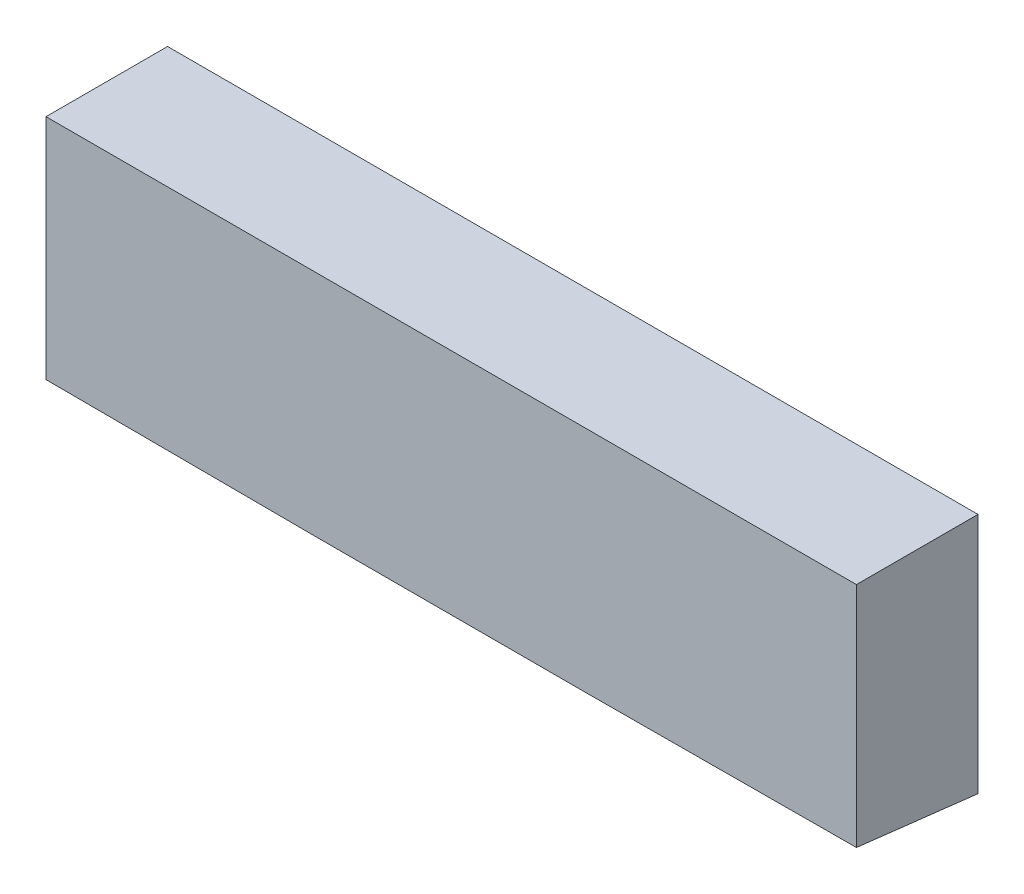
ISO-10303-21;
HEADER;
FILE_DESCRIPTION(('STEP AP214'),'2;1');
FILE_NAME('part.step','',(''),(''),'','','');
FILE_SCHEMA(('AUTOMOTIVE_DESIGN { 1 0 10303 214 1 1 1 1 }'));
ENDSEC;
DATA;
#1=APPLICATION_CONTEXT('core data for automotive mechanical design processes');
#2=APPLICATION_PROTOCOL_DEFINITION('international standard','automotive_design',2000,#1);
#3=PRODUCT_CONTEXT('',#1,'mechanical');
#4=PRODUCT('Part','Part','',(#3));
#5=PRODUCT_RELATED_PRODUCT_CATEGORY('part','',(#4));
#6=PRODUCT_DEFINITION_FORMATION('','',#4);
#7=PRODUCT_DEFINITION_CONTEXT('part definition',#1,'design');
#8=PRODUCT_DEFINITION('design','',#6,#7);
#9=PRODUCT_DEFINITION_SHAPE('','',#8);
#10=(LENGTH_UNIT() NAMED_UNIT(*) SI_UNIT(.MILLI.,.METRE.));
#11=(NAMED_UNIT(*) PLANE_ANGLE_UNIT() SI_UNIT($,.RADIAN.));
#12=(NAMED_UNIT(*) SI_UNIT($,.STERADIAN.) SOLID_ANGLE_UNIT());
#13=UNCERTAINTY_MEASURE_WITH_UNIT(LENGTH_MEASURE(1.E-05),#10,'distance_accuracy_value','');
#14=(GEOMETRIC_REPRESENTATION_CONTEXT(3) GLOBAL_UNCERTAINTY_ASSIGNED_CONTEXT((#13)) GLOBAL_UNIT_ASSIGNED_CONTEXT((#10,
#11,#12)) REPRESENTATION_CONTEXT('',''));
#15=CARTESIAN_POINT('',(0.,0.,0.));
#16=DIRECTION('',(0.,0.,1.));
#17=DIRECTION('',(1.,0.,0.));
#18=AXIS2_PLACEMENT_3D('',#15,#16,#17);
#19=CARTESIAN_POINT('',(0.999999999999936,-5.97130543489562,39.9));
#20=DIRECTION('',(1.,0.,0.));
#21=DIRECTION('',(0.,1.,0.));
#22=AXIS2_PLACEMENT_3D('',#19,#20,#21);
#23=PLANE('',#22);
#24=DIRECTION('',(0.,0.,1.));
#25=VECTOR('',#24,1.);
#26=CARTESIAN_POINT('',(0.999999999999936,-5.34337327370118,39.9));
#27=LINE('',#26,#25);
#28=CARTESIAN_POINT('',(0.999999999999936,-5.34337327370118,41.3912159347219));
#29=VERTEX_POINT('',#28);
#30=CARTESIAN_POINT('',(0.999999999999936,-5.34337327370118,41.6912159347219));
#31=VERTEX_POINT('',#30);
#32=EDGE_CURVE('E59',#29,#31,#27,.T.);
#33=ORIENTED_EDGE('',*,*,#32,.T.);
#34=DIRECTION('',(0.,-1.,0.));
#35=VECTOR('',#34,1.);
#36=CARTESIAN_POINT('',(0.999999999999936,-5.97130543489562,41.6912159347219));
#37=LINE('',#36,#35);
#38=CARTESIAN_POINT('',(0.999999999999936,-5.90536655266498,41.6912159347219));
#39=VERTEX_POINT('',#38);
#40=EDGE_CURVE('E136',#31,#39,#37,.T.);
#41=ORIENTED_EDGE('',*,*,#40,.T.);
#42=CARTESIAN_POINT('',(0.999999999999936,153.583333333334,23.));
#43=DIRECTION('',(-1.,0.,0.));
#44=DIRECTION('',(0.,0.,-1.));
#45=AXIS2_PLACEMENT_3D('',#42,#43,#44);
#46=CIRCLE('',#45,160.580219654989);
#47=CARTESIAN_POINT('',(0.999999999999936,-5.94023897147329,41.3912159347219));
#48=VERTEX_POINT('',#47);
#49=EDGE_CURVE('E11',#48,#39,#46,.T.);
#50=ORIENTED_EDGE('',*,*,#49,.F.);
#51=DIRECTION('',(0.,1.,0.));
#52=VECTOR('',#51,1.);
#53=CARTESIAN_POINT('',(0.999999999999936,-5.97130543489562,41.3912159347219));
#54=LINE('',#53,#52);
#55=EDGE_CURVE('E116',#48,#29,#54,.T.);
#56=ORIENTED_EDGE('',*,*,#55,.T.);
#57=EDGE_LOOP('',(#33,#41,#50,#56));
#58=FACE_BOUND('',#57,.T.);
#59=ADVANCED_FACE('F48',(#58),#23,.T.);
#60=CARTESIAN_POINT('',(0.,153.583333333334,23.));
#61=DIRECTION('',(1.,0.,0.));
#62=DIRECTION('',(0.,0.,1.));
#63=AXIS2_PLACEMENT_3D('',#60,#61,#62);
#64=SPHERICAL_SURFACE('',#63,160.583333333333);
#65=ORIENTED_EDGE('',*,*,#49,.T.);
#66=CARTESIAN_POINT('',(0.,153.583333333334,41.6912159347219));
#67=DIRECTION('',(0.,0.,1.));
#68=DIRECTION('',(1.,0.,0.));
#69=AXIS2_PLACEMENT_3D('',#66,#67,#68);
#70=CIRCLE('',#69,159.491834873532);
#71=CARTESIAN_POINT('',(-1.00000000000006,-5.90536655266499,41.6912159347219));
#72=VERTEX_POINT('',#71);
#73=EDGE_CURVE('E122',#72,#39,#70,.T.);
#74=ORIENTED_EDGE('',*,*,#73,.F.);
#75=CARTESIAN_POINT('',(-1.00000000000006,153.583333333334,23.));
#76=DIRECTION('',(-1.,0.,0.));
#77=DIRECTION('',(0.,0.,1.));
#78=AXIS2_PLACEMENT_3D('',#75,#76,#77);
#79=CIRCLE('',#78,160.580219654989);
#80=CARTESIAN_POINT('',(-1.00000000000006,-5.94023897147331,41.3912159347219));
#81=VERTEX_POINT('',#80);
#82=EDGE_CURVE('E119',#81,#72,#79,.T.);
#83=ORIENTED_EDGE('',*,*,#82,.F.);
#84=CARTESIAN_POINT('',(0.,153.583333333334,41.3912159347219));
#85=DIRECTION('',(0.,0.,1.));
#86=DIRECTION('',(1.,0.,0.));
#87=AXIS2_PLACEMENT_3D('',#84,#85,#86);
#88=CIRCLE('',#87,159.526706607035);
#89=EDGE_CURVE('E121',#81,#48,#88,.T.);
#90=ORIENTED_EDGE('',*,*,#89,.T.);
#91=EDGE_LOOP('',(#65,#74,#83,#90));
#92=FACE_BOUND('',#91,.T.);
#93=ADVANCED_FACE('F50',(#92),#64,.T.);
#94=CARTESIAN_POINT('',(0.,-5.34337327370118,41.3912159347219));
#95=DIRECTION('',(0.,1.,0.));
#96=DIRECTION('',(1.,0.,0.));
#97=AXIS2_PLACEMENT_3D('',#94,#95,#96);
#98=PLANE('',#97);
#99=DIRECTION('',(0.,0.,1.));
#100=VECTOR('',#99,1.);
#101=CARTESIAN_POINT('',(-1.00000000000006,-5.34337327370118,41.3912159347219));
#102=LINE('',#101,#100);
#103=CARTESIAN_POINT('',(-1.00000000000006,-5.34337327370118,41.3912159347219));
#104=VERTEX_POINT('',#103);
#105=CARTESIAN_POINT('',(-1.00000000000006,-5.34337327370118,41.6912159347219));
#106=VERTEX_POINT('',#105);
#107=EDGE_CURVE('E71',#104,#106,#102,.T.);
#108=ORIENTED_EDGE('',*,*,#107,.T.);
#109=DIRECTION('',(1.,0.,0.));
#110=VECTOR('',#109,1.);
#111=CARTESIAN_POINT('',(0.,-5.34337327370118,41.6912159347219));
#112=LINE('',#111,#110);
#113=EDGE_CURVE('E108',#106,#31,#112,.T.);
#114=ORIENTED_EDGE('',*,*,#113,.T.);
#115=ORIENTED_EDGE('',*,*,#32,.F.);
#116=DIRECTION('',(1.,0.,0.));
#117=VECTOR('',#116,1.);
#118=CARTESIAN_POINT('',(0.,-5.34337327370118,41.3912159347219));
#119=LINE('',#118,#117);
#120=EDGE_CURVE('E52',#104,#29,#119,.T.);
#121=ORIENTED_EDGE('',*,*,#120,.F.);
#122=EDGE_LOOP('',(#108,#114,#115,#121));
#123=FACE_BOUND('',#122,.T.);
#124=ADVANCED_FACE('F105',(#123),#98,.T.);
#125=CARTESIAN_POINT('',(-1.00000000000006,-5.97130543489562,39.9));
#126=DIRECTION('',(-1.,0.,0.));
#127=DIRECTION('',(0.,0.,1.));
#128=AXIS2_PLACEMENT_3D('',#125,#126,#127);
#129=PLANE('',#128);
#130=ORIENTED_EDGE('',*,*,#82,.T.);
#131=DIRECTION('',(0.,-1.,0.));
#132=VECTOR('',#131,1.);
#133=CARTESIAN_POINT('',(-1.00000000000006,-5.97130543489562,41.6912159347219));
#134=LINE('',#133,#132);
#135=EDGE_CURVE('E131',#106,#72,#134,.T.);
#136=ORIENTED_EDGE('',*,*,#135,.F.);
#137=ORIENTED_EDGE('',*,*,#107,.F.);
#138=DIRECTION('',(0.,-1.,0.));
#139=VECTOR('',#138,1.);
#140=CARTESIAN_POINT('',(-1.00000000000006,-5.97130543489562,41.3912159347219));
#141=LINE('',#140,#139);
#142=EDGE_CURVE('E117',#104,#81,#141,.T.);
#143=ORIENTED_EDGE('',*,*,#142,.T.);
#144=EDGE_LOOP('',(#130,#136,#137,#143));
#145=FACE_BOUND('',#144,.T.);
#146=ADVANCED_FACE('F149',(#145),#129,.T.);
#147=CARTESIAN_POINT('',(0.,-5.43373195615369,41.3912159347219));
#148=DIRECTION('',(0.,0.,1.));
#149=DIRECTION('',(1.,0.,0.));
#150=AXIS2_PLACEMENT_3D('',#147,#148,#149);
#151=PLANE('',#150);
#152=ORIENTED_EDGE('',*,*,#55,.F.);
#153=ORIENTED_EDGE('',*,*,#89,.F.);
#154=ORIENTED_EDGE('',*,*,#142,.F.);
#155=ORIENTED_EDGE('',*,*,#120,.T.);
#156=EDGE_LOOP('',(#152,#153,#154,#155));
#157=FACE_BOUND('',#156,.T.);
#158=ADVANCED_FACE('F114',(#157),#151,.F.);
#159=CARTESIAN_POINT('',(0.,-5.43373195615369,41.6912159347219));
#160=DIRECTION('',(0.,0.,1.));
#161=DIRECTION('',(1.,0.,0.));
#162=AXIS2_PLACEMENT_3D('',#159,#160,#161);
#163=PLANE('',#162);
#164=ORIENTED_EDGE('',*,*,#40,.F.);
#165=ORIENTED_EDGE('',*,*,#113,.F.);
#166=ORIENTED_EDGE('',*,*,#135,.T.);
#167=ORIENTED_EDGE('',*,*,#73,.T.);
#168=EDGE_LOOP('',(#164,#165,#166,#167));
#169=FACE_BOUND('',#168,.T.);
#170=ADVANCED_FACE('F147',(#169),#163,.T.);
#171=CLOSED_SHELL('',(#59,#93,#124,#146,#158,#170));
#172=MANIFOLD_SOLID_BREP('B2',#171);
#173=ADVANCED_BREP_SHAPE_REPRESENTATION('',(#18,#172),#14);
#174=SHAPE_DEFINITION_REPRESENTATION(#9,#173);
ENDSEC;
END-ISO-10303-21;
